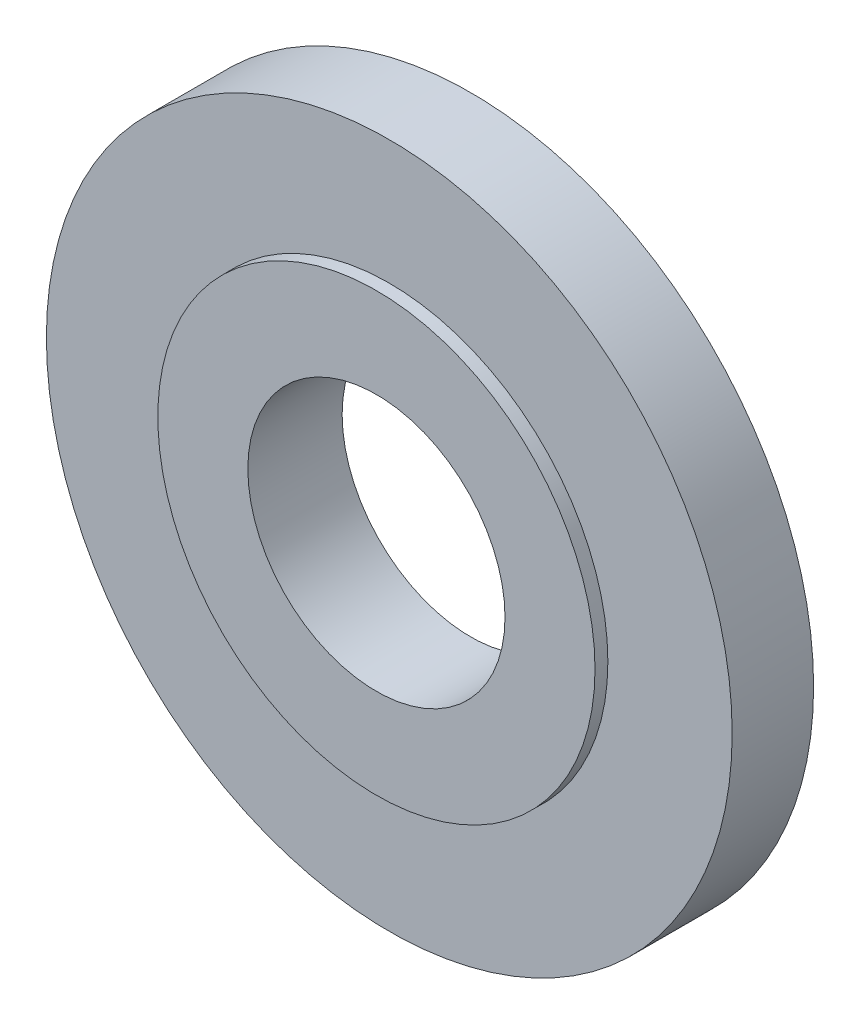
ISO-10303-21;
HEADER;
FILE_DESCRIPTION(('STEP AP214'),'2;1');
FILE_NAME('part.step','',(''),(''),'','','');
FILE_SCHEMA(('AUTOMOTIVE_DESIGN { 1 0 10303 214 1 1 1 1 }'));
ENDSEC;
DATA;
#1=APPLICATION_CONTEXT('core data for automotive mechanical design processes');
#2=APPLICATION_PROTOCOL_DEFINITION('international standard','automotive_design',2000,#1);
#3=PRODUCT_CONTEXT('',#1,'mechanical');
#4=PRODUCT('Part','Part','',(#3));
#5=PRODUCT_RELATED_PRODUCT_CATEGORY('part','',(#4));
#6=PRODUCT_DEFINITION_FORMATION('','',#4);
#7=PRODUCT_DEFINITION_CONTEXT('part definition',#1,'design');
#8=PRODUCT_DEFINITION('design','',#6,#7);
#9=PRODUCT_DEFINITION_SHAPE('','',#8);
#10=(LENGTH_UNIT() NAMED_UNIT(*) SI_UNIT(.MILLI.,.METRE.));
#11=(NAMED_UNIT(*) PLANE_ANGLE_UNIT() SI_UNIT($,.RADIAN.));
#12=(NAMED_UNIT(*) SI_UNIT($,.STERADIAN.) SOLID_ANGLE_UNIT());
#13=UNCERTAINTY_MEASURE_WITH_UNIT(LENGTH_MEASURE(1.E-05),#10,'distance_accuracy_value','');
#14=(GEOMETRIC_REPRESENTATION_CONTEXT(3) GLOBAL_UNCERTAINTY_ASSIGNED_CONTEXT((#13)) GLOBAL_UNIT_ASSIGNED_CONTEXT((#10,
#11,#12)) REPRESENTATION_CONTEXT('',''));
#15=CARTESIAN_POINT('',(0.,0.,0.));
#16=DIRECTION('',(0.,0.,1.));
#17=DIRECTION('',(1.,0.,0.));
#18=AXIS2_PLACEMENT_3D('',#15,#16,#17);
#19=CARTESIAN_POINT('',(0.,0.,-22.0000000000002));
#20=DIRECTION('',(0.,0.,1.));
#21=DIRECTION('',(1.,0.,0.));
#22=AXIS2_PLACEMENT_3D('',#19,#20,#21);
#23=CYLINDRICAL_SURFACE('',#22,51.);
#24=CARTESIAN_POINT('',(0.,0.,-3.00000000000011));
#25=DIRECTION('',(0.,0.,1.));
#26=DIRECTION('',(1.,0.,0.));
#27=AXIS2_PLACEMENT_3D('',#24,#25,#26);
#28=CIRCLE('',#27,51.);
#29=CARTESIAN_POINT('',(51.,0.,-3.00000000000011));
#30=VERTEX_POINT('',#29);
#31=EDGE_CURVE('E10',#30,#30,#28,.F.);
#32=ORIENTED_EDGE('',*,*,#31,.F.);
#33=EDGE_LOOP('',(#32));
#34=FACE_BOUND('',#33,.T.);
#35=CARTESIAN_POINT('',(0.,0.,0.));
#36=DIRECTION('',(0.,0.,1.));
#37=DIRECTION('',(1.,0.,0.));
#38=AXIS2_PLACEMENT_3D('',#35,#36,#37);
#39=CIRCLE('',#38,51.);
#40=CARTESIAN_POINT('',(51.,0.,0.));
#41=VERTEX_POINT('',#40);
#42=EDGE_CURVE('E36',#41,#41,#39,.T.);
#43=ORIENTED_EDGE('',*,*,#42,.F.);
#44=EDGE_LOOP('',(#43));
#45=FACE_BOUND('',#44,.T.);
#46=ADVANCED_FACE('F30',(#34,#45),#23,.T.);
#47=CARTESIAN_POINT('',(0.,0.,0.));
#48=DIRECTION('',(0.,0.,1.));
#49=DIRECTION('',(1.,0.,0.));
#50=AXIS2_PLACEMENT_3D('',#47,#48,#49);
#51=PLANE('',#50);
#52=CARTESIAN_POINT('',(0.,0.,0.));
#53=DIRECTION('',(0.,0.,1.));
#54=DIRECTION('',(1.,0.,0.));
#55=AXIS2_PLACEMENT_3D('',#52,#53,#54);
#56=CIRCLE('',#55,30.);
#57=CARTESIAN_POINT('',(30.,0.,0.));
#58=VERTEX_POINT('',#57);
#59=EDGE_CURVE('E50',#58,#58,#56,.T.);
#60=ORIENTED_EDGE('',*,*,#59,.F.);
#61=EDGE_LOOP('',(#60));
#62=FACE_BOUND('',#61,.T.);
#63=ORIENTED_EDGE('',*,*,#42,.T.);
#64=EDGE_LOOP('',(#63));
#65=FACE_BOUND('',#64,.T.);
#66=ADVANCED_FACE('F65',(#62,#65),#51,.T.);
#67=CARTESIAN_POINT('',(0.,0.,-248.274169979696));
#68=DIRECTION('',(0.,0.,1.));
#69=DIRECTION('',(1.,0.,0.));
#70=AXIS2_PLACEMENT_3D('',#67,#68,#69);
#71=CYLINDRICAL_SURFACE('',#70,80.);
#72=CARTESIAN_POINT('',(0.,0.,-22.0000000000002));
#73=DIRECTION('',(0.,0.,1.));
#74=DIRECTION('',(1.,0.,0.));
#75=AXIS2_PLACEMENT_3D('',#72,#73,#74);
#76=CIRCLE('',#75,80.);
#77=CARTESIAN_POINT('',(80.0000000000001,0.,-22.0000000000002));
#78=VERTEX_POINT('',#77);
#79=EDGE_CURVE('E40',#78,#78,#76,.F.);
#80=CARTESIAN_POINT('',(0.,0.,-3.00000000000011));
#81=DIRECTION('',(0.,0.,1.));
#82=DIRECTION('',(1.,0.,0.));
#83=AXIS2_PLACEMENT_3D('',#80,#81,#82);
#84=CIRCLE('',#83,80.);
#85=CARTESIAN_POINT('',(80.0000000000001,0.,-3.00000000000009));
#86=VERTEX_POINT('',#85);
#87=EDGE_CURVE('E44',#86,#86,#84,.T.);
#88=CARTESIAN_POINT('',(80.0000000000001,0.,-22.0000000000002));
#89=CARTESIAN_POINT('',(80.0000000000001,0.,-21.8020833333335));
#90=CARTESIAN_POINT('',(80.0000000000001,0.,-21.6041666666669));
#91=CARTESIAN_POINT('',(80.0000000000001,0.,-21.2083333333335));
#92=CARTESIAN_POINT('',(80.0000000000001,0.,-21.0104166666669));
#93=CARTESIAN_POINT('',(80.0000000000001,0.,-20.6145833333335));
#94=CARTESIAN_POINT('',(80.0000000000001,0.,-20.4166666666669));
#95=CARTESIAN_POINT('',(80.0000000000001,0.,-20.0208333333335));
#96=CARTESIAN_POINT('',(80.0000000000001,0.,-19.8229166666669));
#97=CARTESIAN_POINT('',(80.0000000000001,0.,-19.4270833333335));
#98=CARTESIAN_POINT('',(80.0000000000001,0.,-19.2291666666669));
#99=CARTESIAN_POINT('',(80.0000000000001,0.,-18.8333333333335));
#100=CARTESIAN_POINT('',(80.0000000000001,0.,-18.6354166666669));
#101=CARTESIAN_POINT('',(80.0000000000001,0.,-18.2395833333335));
#102=CARTESIAN_POINT('',(80.0000000000001,0.,-18.0416666666669));
#103=CARTESIAN_POINT('',(80.0000000000001,0.,-17.6458333333335));
#104=CARTESIAN_POINT('',(80.0000000000001,0.,-17.4479166666669));
#105=CARTESIAN_POINT('',(80.0000000000001,0.,-17.0520833333335));
#106=CARTESIAN_POINT('',(80.0000000000001,0.,-16.8541666666668));
#107=CARTESIAN_POINT('',(80.0000000000001,0.,-16.4583333333335));
#108=CARTESIAN_POINT('',(80.0000000000001,0.,-16.2604166666668));
#109=CARTESIAN_POINT('',(80.0000000000001,0.,-15.8645833333335));
#110=CARTESIAN_POINT('',(80.0000000000001,0.,-15.6666666666668));
#111=CARTESIAN_POINT('',(80.0000000000001,0.,-15.2708333333335));
#112=CARTESIAN_POINT('',(80.0000000000001,0.,-15.0729166666668));
#113=CARTESIAN_POINT('',(80.0000000000001,0.,-14.6770833333335));
#114=CARTESIAN_POINT('',(80.0000000000001,0.,-14.4791666666668));
#115=CARTESIAN_POINT('',(80.0000000000001,0.,-14.0833333333335));
#116=CARTESIAN_POINT('',(80.0000000000001,0.,-13.8854166666668));
#117=CARTESIAN_POINT('',(80.0000000000001,0.,-13.4895833333335));
#118=CARTESIAN_POINT('',(80.0000000000001,0.,-13.2916666666668));
#119=CARTESIAN_POINT('',(80.0000000000001,0.,-12.8958333333335));
#120=CARTESIAN_POINT('',(80.0000000000001,0.,-12.6979166666668));
#121=CARTESIAN_POINT('',(80.0000000000001,0.,-12.3020833333335));
#122=CARTESIAN_POINT('',(80.0000000000001,0.,-12.1041666666668));
#123=CARTESIAN_POINT('',(80.0000000000001,0.,-11.7083333333335));
#124=CARTESIAN_POINT('',(80.0000000000001,0.,-11.5104166666668));
#125=CARTESIAN_POINT('',(80.0000000000001,0.,-11.1145833333335));
#126=CARTESIAN_POINT('',(80.0000000000001,0.,-10.9166666666668));
#127=CARTESIAN_POINT('',(80.0000000000001,0.,-10.5208333333335));
#128=CARTESIAN_POINT('',(80.0000000000001,0.,-10.3229166666668));
#129=CARTESIAN_POINT('',(80.0000000000001,0.,-9.92708333333347));
#130=CARTESIAN_POINT('',(80.0000000000001,0.,-9.7291666666668));
#131=CARTESIAN_POINT('',(80.0000000000001,0.,-9.33333333333346));
#132=CARTESIAN_POINT('',(80.0000000000001,0.,-9.13541666666679));
#133=CARTESIAN_POINT('',(80.0000000000001,0.,-8.73958333333346));
#134=CARTESIAN_POINT('',(80.0000000000001,0.,-8.54166666666679));
#135=CARTESIAN_POINT('',(80.0000000000001,0.,-8.14583333333345));
#136=CARTESIAN_POINT('',(80.0000000000001,0.,-7.94791666666679));
#137=CARTESIAN_POINT('',(80.0000000000001,0.,-7.55208333333345));
#138=CARTESIAN_POINT('',(80.0000000000001,0.,-7.35416666666678));
#139=CARTESIAN_POINT('',(80.0000000000001,0.,-6.95833333333345));
#140=CARTESIAN_POINT('',(80.0000000000001,0.,-6.76041666666678));
#141=CARTESIAN_POINT('',(80.0000000000001,0.,-6.36458333333344));
#142=CARTESIAN_POINT('',(80.0000000000001,0.,-6.16666666666677));
#143=CARTESIAN_POINT('',(80.0000000000001,0.,-5.77083333333344));
#144=CARTESIAN_POINT('',(80.0000000000001,0.,-5.57291666666677));
#145=CARTESIAN_POINT('',(80.0000000000001,0.,-5.17708333333343));
#146=CARTESIAN_POINT('',(80.0000000000001,0.,-4.97916666666677));
#147=CARTESIAN_POINT('',(80.0000000000001,0.,-4.58333333333343));
#148=CARTESIAN_POINT('',(80.0000000000001,0.,-4.38541666666676));
#149=CARTESIAN_POINT('',(80.0000000000001,0.,-3.98958333333343));
#150=CARTESIAN_POINT('',(80.0000000000001,0.,-3.79166666666676));
#151=CARTESIAN_POINT('',(80.0000000000001,0.,-3.39583333333342));
#152=CARTESIAN_POINT('',(80.0000000000001,0.,-3.19791666666675));
#153=CARTESIAN_POINT('',(80.0000000000001,0.,-3.00000000000009));
#154=B_SPLINE_CURVE_WITH_KNOTS('',3,(#88,#89,#90,#91,#92,#93,#94,#95,#96,#97,#98,#99,#100,#101,
#102,#103,#104,#105,#106,#107,#108,#109,#110,#111,#112,#113,#114,#115,#116,#117,#118,#119,#120,
#121,#122,#123,#124,#125,#126,#127,#128,#129,#130,#131,#132,#133,#134,#135,#136,#137,#138,#139,
#140,#141,#142,#143,#144,#145,#146,#147,#148,#149,#150,#151,#152,#153),.UNSPECIFIED.,.F.,.F.,(4,
2,2,2,2,2,2,2,2,2,2,2,2,2,2,2,2,2,2,2,2,2,2,2,2,2,2,2,2,2,2,2,4),(0.,0.593750000000004,
1.18750000000001,1.78125000000001,2.37500000000002,2.96875000000002,3.56250000000002,
4.15625000000003,4.75000000000003,5.34375000000004,5.93750000000004,6.53125000000004,
7.12500000000005,7.71875000000005,8.31250000000006,8.90625000000006,9.50000000000006,
10.0937500000001,10.6875000000001,11.2812500000001,11.8750000000001,12.4687500000001,
13.0625000000001,13.6562500000001,14.2500000000001,14.8437500000001,15.4375000000001,
16.0312500000001,16.6250000000001,17.2187500000001,17.8125000000001,18.4062500000001,
19.0000000000001),.UNSPECIFIED.);
#155=EDGE_CURVE('BSEAM67',#78,#86,#154,.T.);
#156=ORIENTED_EDGE('',*,*,#79,.F.);
#157=ORIENTED_EDGE('',*,*,#87,.F.);
#158=ORIENTED_EDGE('',*,*,#155,.T.);
#159=ORIENTED_EDGE('',*,*,#155,.F.);
#160=EDGE_LOOP('',(#156,#158,#157,#159));
#161=FACE_BOUND('',#160,.T.);
#162=ADVANCED_FACE('F67',(#161),#71,.T.);
#163=CARTESIAN_POINT('',(0.,0.,-3.00000000000011));
#164=DIRECTION('',(0.,0.,1.));
#165=DIRECTION('',(1.,0.,0.));
#166=AXIS2_PLACEMENT_3D('',#163,#164,#165);
#167=PLANE('',#166);
#168=ORIENTED_EDGE('',*,*,#31,.T.);
#169=EDGE_LOOP('',(#168));
#170=FACE_BOUND('',#169,.T.);
#171=ORIENTED_EDGE('',*,*,#87,.T.);
#172=EDGE_LOOP('',(#171));
#173=FACE_BOUND('',#172,.T.);
#174=ADVANCED_FACE('F72',(#170,#173),#167,.T.);
#175=CARTESIAN_POINT('',(0.,0.,-22.0000000000002));
#176=DIRECTION('',(0.,0.,1.));
#177=DIRECTION('',(1.,0.,0.));
#178=AXIS2_PLACEMENT_3D('',#175,#176,#177);
#179=PLANE('',#178);
#180=CARTESIAN_POINT('',(0.,0.,-22.0000000000002));
#181=DIRECTION('',(0.,0.,1.));
#182=DIRECTION('',(1.,0.,0.));
#183=AXIS2_PLACEMENT_3D('',#180,#181,#182);
#184=CIRCLE('',#183,30.);
#185=CARTESIAN_POINT('',(30.,0.,-22.0000000000002));
#186=VERTEX_POINT('',#185);
#187=EDGE_CURVE('E49',#186,#186,#184,.T.);
#188=ORIENTED_EDGE('',*,*,#187,.T.);
#189=EDGE_LOOP('',(#188));
#190=FACE_BOUND('',#189,.T.);
#191=ORIENTED_EDGE('',*,*,#79,.T.);
#192=EDGE_LOOP('',(#191));
#193=FACE_BOUND('',#192,.T.);
#194=ADVANCED_FACE('F56',(#190,#193),#179,.F.);
#195=CARTESIAN_POINT('',(0.,0.,-22.0000000000002));
#196=DIRECTION('',(0.,0.,1.));
#197=DIRECTION('',(1.,0.,0.));
#198=AXIS2_PLACEMENT_3D('',#195,#196,#197);
#199=CYLINDRICAL_SURFACE('',#198,30.);
#200=ORIENTED_EDGE('',*,*,#187,.F.);
#201=EDGE_LOOP('',(#200));
#202=FACE_BOUND('',#201,.T.);
#203=ORIENTED_EDGE('',*,*,#59,.T.);
#204=EDGE_LOOP('',(#203));
#205=FACE_BOUND('',#204,.T.);
#206=ADVANCED_FACE('F59',(#202,#205),#199,.F.);
#207=CLOSED_SHELL('',(#46,#66,#162,#174,#194,#206));
#208=MANIFOLD_SOLID_BREP('B2',#207);
#209=ADVANCED_BREP_SHAPE_REPRESENTATION('',(#18,#208),#14);
#210=SHAPE_DEFINITION_REPRESENTATION(#9,#209);
ENDSEC;
END-ISO-10303-21;
